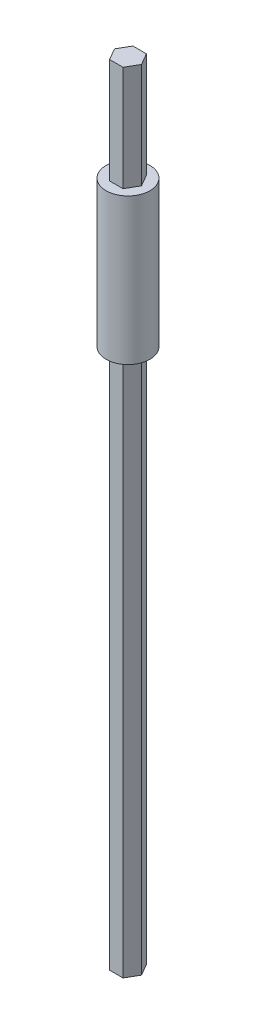
ISO-10303-21;
HEADER;
FILE_DESCRIPTION(('STEP AP214'),'2;1');
FILE_NAME('part.step','',(''),(''),'','','');
FILE_SCHEMA(('AUTOMOTIVE_DESIGN { 1 0 10303 214 1 1 1 1 }'));
ENDSEC;
DATA;
#1=APPLICATION_CONTEXT('core data for automotive mechanical design processes');
#2=APPLICATION_PROTOCOL_DEFINITION('international standard','automotive_design',2000,#1);
#3=PRODUCT_CONTEXT('',#1,'mechanical');
#4=PRODUCT('Part','Part','',(#3));
#5=PRODUCT_RELATED_PRODUCT_CATEGORY('part','',(#4));
#6=PRODUCT_DEFINITION_FORMATION('','',#4);
#7=PRODUCT_DEFINITION_CONTEXT('part definition',#1,'design');
#8=PRODUCT_DEFINITION('design','',#6,#7);
#9=PRODUCT_DEFINITION_SHAPE('','',#8);
#10=(LENGTH_UNIT() NAMED_UNIT(*) SI_UNIT(.MILLI.,.METRE.));
#11=(NAMED_UNIT(*) PLANE_ANGLE_UNIT() SI_UNIT($,.RADIAN.));
#12=(NAMED_UNIT(*) SI_UNIT($,.STERADIAN.) SOLID_ANGLE_UNIT());
#13=UNCERTAINTY_MEASURE_WITH_UNIT(LENGTH_MEASURE(1.E-05),#10,'distance_accuracy_value','');
#14=(GEOMETRIC_REPRESENTATION_CONTEXT(3) GLOBAL_UNCERTAINTY_ASSIGNED_CONTEXT((#13)) GLOBAL_UNIT_ASSIGNED_CONTEXT((#10,
#11,#12)) REPRESENTATION_CONTEXT('',''));
#15=CARTESIAN_POINT('',(0.,0.,0.));
#16=DIRECTION('',(0.,0.,1.));
#17=DIRECTION('',(1.,0.,0.));
#18=AXIS2_PLACEMENT_3D('',#15,#16,#17);
#19=CARTESIAN_POINT('',(1.5556349186104,71.3,-1.5556349186104));
#20=DIRECTION('',(0.,1.,0.));
#21=DIRECTION('',(0.,0.,1.));
#22=AXIS2_PLACEMENT_3D('',#19,#20,#21);
#23=PLANE('',#22);
#24=CARTESIAN_POINT('',(1.5556349186104,71.3,-1.5556349186104));
#25=DIRECTION('',(0.,1.,0.));
#26=DIRECTION('',(0.,0.,1.));
#27=AXIS2_PLACEMENT_3D('',#24,#25,#26);
#28=CIRCLE('',#27,3.75);
#29=CARTESIAN_POINT('',(1.5556349186104,71.3,2.1943650813896));
#30=VERTEX_POINT('',#29);
#31=EDGE_CURVE('E37',#30,#30,#28,.T.);
#32=ORIENTED_EDGE('',*,*,#31,.F.);
#33=EDGE_LOOP('',(#32));
#34=FACE_BOUND('',#33,.T.);
#35=DIRECTION('',(0.5,0.,0.866025403784439));
#36=VECTOR('',#35,1.);
#37=CARTESIAN_POINT('',(2.71033545698966,71.3,-3.55563491861041));
#38=LINE('',#37,#36);
#39=CARTESIAN_POINT('',(2.71033545698966,71.3,-3.55563491861041));
#40=VERTEX_POINT('',#39);
#41=CARTESIAN_POINT('',(3.86503599536891,71.3,-1.5556349186104));
#42=VERTEX_POINT('',#41);
#43=EDGE_CURVE('E142',#40,#42,#38,.T.);
#44=ORIENTED_EDGE('',*,*,#43,.F.);
#45=DIRECTION('',(1.,0.,0.));
#46=VECTOR('',#45,1.);
#47=CARTESIAN_POINT('',(0.400934380231152,71.3,-3.5556349186104));
#48=LINE('',#47,#46);
#49=CARTESIAN_POINT('',(0.400934380231152,71.3,-3.55563491861041));
#50=VERTEX_POINT('',#49);
#51=EDGE_CURVE('E139',#50,#40,#48,.T.);
#52=ORIENTED_EDGE('',*,*,#51,.F.);
#53=DIRECTION('',(0.5,0.,-0.866025403784438));
#54=VECTOR('',#53,1.);
#55=CARTESIAN_POINT('',(-0.7537661581481,71.3,-1.55563491861041));
#56=LINE('',#55,#54);
#57=CARTESIAN_POINT('',(-0.753766158148099,71.3,-1.55563491861041));
#58=VERTEX_POINT('',#57);
#59=EDGE_CURVE('E207',#58,#50,#56,.T.);
#60=ORIENTED_EDGE('',*,*,#59,.F.);
#61=DIRECTION('',(-0.5,0.,-0.866025403784439));
#62=VECTOR('',#61,1.);
#63=CARTESIAN_POINT('',(0.400934380231152,71.3,0.444365081389597));
#64=LINE('',#63,#62);
#65=CARTESIAN_POINT('',(0.400934380231153,71.3,0.444365081389597));
#66=VERTEX_POINT('',#65);
#67=EDGE_CURVE('E224',#66,#58,#64,.T.);
#68=ORIENTED_EDGE('',*,*,#67,.F.);
#69=DIRECTION('',(-1.,0.,0.));
#70=VECTOR('',#69,1.);
#71=CARTESIAN_POINT('',(2.71033545698965,71.3,0.444365081389597));
#72=LINE('',#71,#70);
#73=CARTESIAN_POINT('',(2.71033545698965,71.3,0.444365081389597));
#74=VERTEX_POINT('',#73);
#75=EDGE_CURVE('E53',#74,#66,#72,.T.);
#76=ORIENTED_EDGE('',*,*,#75,.F.);
#77=DIRECTION('',(-0.5,0.,0.866025403784438));
#78=VECTOR('',#77,1.);
#79=CARTESIAN_POINT('',(3.86503599536891,71.3,-1.5556349186104));
#80=LINE('',#79,#78);
#81=EDGE_CURVE('E48',#42,#74,#80,.T.);
#82=ORIENTED_EDGE('',*,*,#81,.F.);
#83=EDGE_LOOP('',(#44,#52,#60,#68,#76,#82));
#84=FACE_BOUND('',#83,.T.);
#85=ADVANCED_FACE('F33',(#34,#84),#23,.F.);
#86=CARTESIAN_POINT('',(1.5556349186104,96.3,-1.5556349186104));
#87=DIRECTION('',(0.,1.,0.));
#88=DIRECTION('',(0.,0.,1.));
#89=AXIS2_PLACEMENT_3D('',#86,#87,#88);
#90=PLANE('',#89);
#91=CARTESIAN_POINT('',(1.5556349186104,96.3,-1.5556349186104));
#92=DIRECTION('',(0.,1.,0.));
#93=DIRECTION('',(0.,0.,1.));
#94=AXIS2_PLACEMENT_3D('',#91,#92,#93);
#95=CIRCLE('',#94,3.75);
#96=CARTESIAN_POINT('',(1.5556349186104,96.3,2.1943650813896));
#97=VERTEX_POINT('',#96);
#98=EDGE_CURVE('E11',#97,#97,#95,.T.);
#99=ORIENTED_EDGE('',*,*,#98,.T.);
#100=EDGE_LOOP('',(#99));
#101=FACE_BOUND('',#100,.T.);
#102=DIRECTION('',(-0.5,0.,-0.866025403784439));
#103=VECTOR('',#102,1.);
#104=CARTESIAN_POINT('',(3.86503599536891,96.3,-1.55563491861041));
#105=LINE('',#104,#103);
#106=CARTESIAN_POINT('',(3.86503599536891,96.3,-1.55563491861041));
#107=VERTEX_POINT('',#106);
#108=CARTESIAN_POINT('',(2.71033545698966,96.3,-3.55563491861041));
#109=VERTEX_POINT('',#108);
#110=EDGE_CURVE('E146',#107,#109,#105,.T.);
#111=ORIENTED_EDGE('',*,*,#110,.F.);
#112=DIRECTION('',(0.5,0.,-0.866025403784439));
#113=VECTOR('',#112,1.);
#114=CARTESIAN_POINT('',(2.71033545698966,96.3,0.444365081389596));
#115=LINE('',#114,#113);
#116=CARTESIAN_POINT('',(2.71033545698966,96.3,0.444365081389596));
#117=VERTEX_POINT('',#116);
#118=EDGE_CURVE('E143',#117,#107,#115,.T.);
#119=ORIENTED_EDGE('',*,*,#118,.F.);
#120=DIRECTION('',(1.,0.,0.));
#121=VECTOR('',#120,1.);
#122=CARTESIAN_POINT('',(0.400934380231153,96.3,0.444365081389596));
#123=LINE('',#122,#121);
#124=CARTESIAN_POINT('',(0.400934380231152,96.3,0.444365081389596));
#125=VERTEX_POINT('',#124);
#126=EDGE_CURVE('E156',#125,#117,#123,.T.);
#127=ORIENTED_EDGE('',*,*,#126,.F.);
#128=DIRECTION('',(0.5,0.,0.866025403784438));
#129=VECTOR('',#128,1.);
#130=CARTESIAN_POINT('',(-0.753766158148099,96.3,-1.5556349186104));
#131=LINE('',#130,#129);
#132=CARTESIAN_POINT('',(-0.753766158148099,96.3,-1.5556349186104));
#133=VERTEX_POINT('',#132);
#134=EDGE_CURVE('E172',#133,#125,#131,.T.);
#135=ORIENTED_EDGE('',*,*,#134,.F.);
#136=DIRECTION('',(-0.5,0.,0.866025403784439));
#137=VECTOR('',#136,1.);
#138=CARTESIAN_POINT('',(0.400934380231153,96.3,-3.55563491861041));
#139=LINE('',#138,#137);
#140=CARTESIAN_POINT('',(0.400934380231153,96.3,-3.55563491861041));
#141=VERTEX_POINT('',#140);
#142=EDGE_CURVE('E170',#141,#133,#139,.T.);
#143=ORIENTED_EDGE('',*,*,#142,.F.);
#144=DIRECTION('',(-1.,0.,0.));
#145=VECTOR('',#144,1.);
#146=CARTESIAN_POINT('',(2.71033545698966,96.3,-3.55563491861041));
#147=LINE('',#146,#145);
#148=EDGE_CURVE('E168',#109,#141,#147,.T.);
#149=ORIENTED_EDGE('',*,*,#148,.F.);
#150=EDGE_LOOP('',(#111,#119,#127,#135,#143,#149));
#151=FACE_BOUND('',#150,.T.);
#152=ADVANCED_FACE('F197',(#101,#151),#90,.T.);
#153=CARTESIAN_POINT('',(1.5556349186104,96.3,-1.5556349186104));
#154=DIRECTION('',(0.,-1.,0.));
#155=DIRECTION('',(0.,0.,-1.));
#156=AXIS2_PLACEMENT_3D('',#153,#154,#155);
#157=CYLINDRICAL_SURFACE('',#156,3.75);
#158=ORIENTED_EDGE('',*,*,#98,.F.);
#159=EDGE_LOOP('',(#158));
#160=FACE_BOUND('',#159,.T.);
#161=ORIENTED_EDGE('',*,*,#31,.T.);
#162=EDGE_LOOP('',(#161));
#163=FACE_BOUND('',#162,.T.);
#164=ADVANCED_FACE('F35',(#160,#163),#157,.T.);
#165=CARTESIAN_POINT('',(2.71033545698966,114.3,0.444365081389596));
#166=DIRECTION('',(-0.866025403784439,0.,-0.5));
#167=DIRECTION('',(-0.5,0.,0.866025403784439));
#168=AXIS2_PLACEMENT_3D('',#165,#166,#167);
#169=PLANE('',#168);
#170=ORIENTED_EDGE('',*,*,#118,.T.);
#171=DIRECTION('',(0.,-1.,0.));
#172=VECTOR('',#171,1.);
#173=CARTESIAN_POINT('',(3.86503599536891,114.3,-1.55563491861041));
#174=LINE('',#173,#172);
#175=CARTESIAN_POINT('',(3.86503599536891,114.3,-1.55563491861041));
#176=VERTEX_POINT('',#175);
#177=EDGE_CURVE('E189',#176,#107,#174,.T.);
#178=ORIENTED_EDGE('',*,*,#177,.F.);
#179=DIRECTION('',(0.5,0.,-0.866025403784439));
#180=VECTOR('',#179,1.);
#181=CARTESIAN_POINT('',(2.71033545698966,114.3,0.444365081389596));
#182=LINE('',#181,#180);
#183=CARTESIAN_POINT('',(2.71033545698966,114.3,0.444365081389596));
#184=VERTEX_POINT('',#183);
#185=EDGE_CURVE('E152',#184,#176,#182,.T.);
#186=ORIENTED_EDGE('',*,*,#185,.F.);
#187=DIRECTION('',(0.,-1.,0.));
#188=VECTOR('',#187,1.);
#189=CARTESIAN_POINT('',(2.71033545698966,114.3,0.444365081389596));
#190=LINE('',#189,#188);
#191=EDGE_CURVE('E165',#184,#117,#190,.T.);
#192=ORIENTED_EDGE('',*,*,#191,.T.);
#193=EDGE_LOOP('',(#170,#178,#186,#192));
#194=FACE_BOUND('',#193,.T.);
#195=ADVANCED_FACE('F276',(#194),#169,.F.);
#196=CARTESIAN_POINT('',(3.86503599536891,114.3,-1.55563491861041));
#197=DIRECTION('',(-0.866025403784439,0.,0.5));
#198=DIRECTION('',(0.5,0.,0.866025403784439));
#199=AXIS2_PLACEMENT_3D('',#196,#197,#198);
#200=PLANE('',#199);
#201=ORIENTED_EDGE('',*,*,#110,.T.);
#202=DIRECTION('',(0.,-1.,0.));
#203=VECTOR('',#202,1.);
#204=CARTESIAN_POINT('',(2.71033545698966,114.3,-3.55563491861041));
#205=LINE('',#204,#203);
#206=CARTESIAN_POINT('',(2.71033545698966,114.3,-3.55563491861041));
#207=VERTEX_POINT('',#206);
#208=EDGE_CURVE('E186',#207,#109,#205,.T.);
#209=ORIENTED_EDGE('',*,*,#208,.F.);
#210=DIRECTION('',(-0.5,0.,-0.866025403784439));
#211=VECTOR('',#210,1.);
#212=CARTESIAN_POINT('',(3.86503599536891,114.3,-1.55563491861041));
#213=LINE('',#212,#211);
#214=EDGE_CURVE('E155',#176,#207,#213,.T.);
#215=ORIENTED_EDGE('',*,*,#214,.F.);
#216=ORIENTED_EDGE('',*,*,#177,.T.);
#217=EDGE_LOOP('',(#201,#209,#215,#216));
#218=FACE_BOUND('',#217,.T.);
#219=ADVANCED_FACE('F272',(#218),#200,.F.);
#220=CARTESIAN_POINT('',(2.71033545698966,114.3,-3.55563491861041));
#221=DIRECTION('',(0.,0.,1.));
#222=DIRECTION('',(1.,0.,0.));
#223=AXIS2_PLACEMENT_3D('',#220,#221,#222);
#224=PLANE('',#223);
#225=ORIENTED_EDGE('',*,*,#148,.T.);
#226=DIRECTION('',(0.,-1.,0.));
#227=VECTOR('',#226,1.);
#228=CARTESIAN_POINT('',(0.400934380231153,114.3,-3.55563491861041));
#229=LINE('',#228,#227);
#230=CARTESIAN_POINT('',(0.400934380231153,114.3,-3.55563491861041));
#231=VERTEX_POINT('',#230);
#232=EDGE_CURVE('E183',#231,#141,#229,.T.);
#233=ORIENTED_EDGE('',*,*,#232,.F.);
#234=DIRECTION('',(-1.,0.,0.));
#235=VECTOR('',#234,1.);
#236=CARTESIAN_POINT('',(2.71033545698966,114.3,-3.55563491861041));
#237=LINE('',#236,#235);
#238=EDGE_CURVE('E158',#207,#231,#237,.T.);
#239=ORIENTED_EDGE('',*,*,#238,.F.);
#240=ORIENTED_EDGE('',*,*,#208,.T.);
#241=EDGE_LOOP('',(#225,#233,#239,#240));
#242=FACE_BOUND('',#241,.T.);
#243=ADVANCED_FACE('F268',(#242),#224,.F.);
#244=CARTESIAN_POINT('',(0.400934380231153,114.3,-3.55563491861041));
#245=DIRECTION('',(0.866025403784439,0.,0.5));
#246=DIRECTION('',(0.5,0.,-0.866025403784439));
#247=AXIS2_PLACEMENT_3D('',#244,#245,#246);
#248=PLANE('',#247);
#249=ORIENTED_EDGE('',*,*,#142,.T.);
#250=DIRECTION('',(0.,-1.,0.));
#251=VECTOR('',#250,1.);
#252=CARTESIAN_POINT('',(-0.753766158148099,114.3,-1.5556349186104));
#253=LINE('',#252,#251);
#254=CARTESIAN_POINT('',(-0.753766158148099,114.3,-1.5556349186104));
#255=VERTEX_POINT('',#254);
#256=EDGE_CURVE('E180',#255,#133,#253,.T.);
#257=ORIENTED_EDGE('',*,*,#256,.F.);
#258=DIRECTION('',(-0.5,0.,0.866025403784439));
#259=VECTOR('',#258,1.);
#260=CARTESIAN_POINT('',(0.400934380231153,114.3,-3.55563491861041));
#261=LINE('',#260,#259);
#262=EDGE_CURVE('E160',#231,#255,#261,.T.);
#263=ORIENTED_EDGE('',*,*,#262,.F.);
#264=ORIENTED_EDGE('',*,*,#232,.T.);
#265=EDGE_LOOP('',(#249,#257,#263,#264));
#266=FACE_BOUND('',#265,.T.);
#267=ADVANCED_FACE('F264',(#266),#248,.F.);
#268=CARTESIAN_POINT('',(-0.753766158148099,114.3,-1.5556349186104));
#269=DIRECTION('',(0.866025403784439,0.,-0.5));
#270=DIRECTION('',(-0.5,0.,-0.866025403784439));
#271=AXIS2_PLACEMENT_3D('',#268,#269,#270);
#272=PLANE('',#271);
#273=ORIENTED_EDGE('',*,*,#134,.T.);
#274=DIRECTION('',(0.,-1.,0.));
#275=VECTOR('',#274,1.);
#276=CARTESIAN_POINT('',(0.400934380231153,114.3,0.444365081389596));
#277=LINE('',#276,#275);
#278=CARTESIAN_POINT('',(0.400934380231153,114.3,0.444365081389596));
#279=VERTEX_POINT('',#278);
#280=EDGE_CURVE('E178',#279,#125,#277,.T.);
#281=ORIENTED_EDGE('',*,*,#280,.F.);
#282=DIRECTION('',(0.5,0.,0.866025403784438));
#283=VECTOR('',#282,1.);
#284=CARTESIAN_POINT('',(-0.753766158148099,114.3,-1.5556349186104));
#285=LINE('',#284,#283);
#286=EDGE_CURVE('E162',#255,#279,#285,.T.);
#287=ORIENTED_EDGE('',*,*,#286,.F.);
#288=ORIENTED_EDGE('',*,*,#256,.T.);
#289=EDGE_LOOP('',(#273,#281,#287,#288));
#290=FACE_BOUND('',#289,.T.);
#291=ADVANCED_FACE('F260',(#290),#272,.F.);
#292=CARTESIAN_POINT('',(0.400934380231153,114.3,0.444365081389596));
#293=DIRECTION('',(0.,0.,-1.));
#294=DIRECTION('',(-1.,0.,0.));
#295=AXIS2_PLACEMENT_3D('',#292,#293,#294);
#296=PLANE('',#295);
#297=ORIENTED_EDGE('',*,*,#126,.T.);
#298=ORIENTED_EDGE('',*,*,#191,.F.);
#299=DIRECTION('',(1.,0.,0.));
#300=VECTOR('',#299,1.);
#301=CARTESIAN_POINT('',(0.400934380231153,114.3,0.444365081389596));
#302=LINE('',#301,#300);
#303=EDGE_CURVE('E164',#279,#184,#302,.T.);
#304=ORIENTED_EDGE('',*,*,#303,.F.);
#305=ORIENTED_EDGE('',*,*,#280,.T.);
#306=EDGE_LOOP('',(#297,#298,#304,#305));
#307=FACE_BOUND('',#306,.T.);
#308=ADVANCED_FACE('F256',(#307),#296,.F.);
#309=CARTESIAN_POINT('',(0.,114.3,0.));
#310=DIRECTION('',(0.,1.,0.));
#311=DIRECTION('',(0.,0.,1.));
#312=AXIS2_PLACEMENT_3D('',#309,#310,#311);
#313=PLANE('',#312);
#314=ORIENTED_EDGE('',*,*,#185,.T.);
#315=ORIENTED_EDGE('',*,*,#214,.T.);
#316=ORIENTED_EDGE('',*,*,#238,.T.);
#317=ORIENTED_EDGE('',*,*,#262,.T.);
#318=ORIENTED_EDGE('',*,*,#286,.T.);
#319=ORIENTED_EDGE('',*,*,#303,.T.);
#320=EDGE_LOOP('',(#314,#315,#316,#317,#318,#319));
#321=FACE_BOUND('',#320,.T.);
#322=ADVANCED_FACE('F253',(#321),#313,.T.);
#323=CARTESIAN_POINT('',(2.71033545698966,-20.7,-3.55563491861041));
#324=DIRECTION('',(-0.866025403784439,0.,0.5));
#325=DIRECTION('',(0.5,0.,0.866025403784439));
#326=AXIS2_PLACEMENT_3D('',#323,#324,#325);
#327=PLANE('',#326);
#328=ORIENTED_EDGE('',*,*,#43,.T.);
#329=DIRECTION('',(0.,1.,0.));
#330=VECTOR('',#329,1.);
#331=CARTESIAN_POINT('',(3.86503599536891,-20.7,-1.5556349186104));
#332=LINE('',#331,#330);
#333=CARTESIAN_POINT('',(3.86503599536891,-20.7,-1.5556349186104));
#334=VERTEX_POINT('',#333);
#335=EDGE_CURVE('E123',#334,#42,#332,.T.);
#336=ORIENTED_EDGE('',*,*,#335,.F.);
#337=DIRECTION('',(0.5,0.,0.866025403784439));
#338=VECTOR('',#337,1.);
#339=CARTESIAN_POINT('',(2.71033545698966,-20.7,-3.55563491861041));
#340=LINE('',#339,#338);
#341=CARTESIAN_POINT('',(2.71033545698966,-20.7,-3.55563491861041));
#342=VERTEX_POINT('',#341);
#343=EDGE_CURVE('E130',#342,#334,#340,.T.);
#344=ORIENTED_EDGE('',*,*,#343,.F.);
#345=DIRECTION('',(0.,1.,0.));
#346=VECTOR('',#345,1.);
#347=CARTESIAN_POINT('',(2.71033545698966,-20.7,-3.55563491861041));
#348=LINE('',#347,#346);
#349=EDGE_CURVE('E204',#342,#40,#348,.T.);
#350=ORIENTED_EDGE('',*,*,#349,.T.);
#351=EDGE_LOOP('',(#328,#336,#344,#350));
#352=FACE_BOUND('',#351,.T.);
#353=ADVANCED_FACE('F141',(#352),#327,.F.);
#354=CARTESIAN_POINT('',(3.86503599536891,-20.7,-1.5556349186104));
#355=DIRECTION('',(-0.866025403784438,0.,-0.5));
#356=DIRECTION('',(-0.5,0.,0.866025403784438));
#357=AXIS2_PLACEMENT_3D('',#354,#355,#356);
#358=PLANE('',#357);
#359=ORIENTED_EDGE('',*,*,#81,.T.);
#360=DIRECTION('',(0.,1.,0.));
#361=VECTOR('',#360,1.);
#362=CARTESIAN_POINT('',(2.71033545698965,-20.7,0.444365081389597));
#363=LINE('',#362,#361);
#364=CARTESIAN_POINT('',(2.71033545698965,-20.7,0.444365081389597));
#365=VERTEX_POINT('',#364);
#366=EDGE_CURVE('E126',#365,#74,#363,.T.);
#367=ORIENTED_EDGE('',*,*,#366,.F.);
#368=DIRECTION('',(-0.5,0.,0.866025403784438));
#369=VECTOR('',#368,1.);
#370=CARTESIAN_POINT('',(3.86503599536891,-20.7,-1.5556349186104));
#371=LINE('',#370,#369);
#372=EDGE_CURVE('E119',#334,#365,#371,.T.);
#373=ORIENTED_EDGE('',*,*,#372,.F.);
#374=ORIENTED_EDGE('',*,*,#335,.T.);
#375=EDGE_LOOP('',(#359,#367,#373,#374));
#376=FACE_BOUND('',#375,.T.);
#377=ADVANCED_FACE('F121',(#376),#358,.F.);
#378=CARTESIAN_POINT('',(2.71033545698965,-20.7,0.444365081389597));
#379=DIRECTION('',(0.,0.,-1.));
#380=DIRECTION('',(-1.,0.,0.));
#381=AXIS2_PLACEMENT_3D('',#378,#379,#380);
#382=PLANE('',#381);
#383=ORIENTED_EDGE('',*,*,#75,.T.);
#384=DIRECTION('',(0.,1.,0.));
#385=VECTOR('',#384,1.);
#386=CARTESIAN_POINT('',(0.400934380231152,-20.7,0.444365081389597));
#387=LINE('',#386,#385);
#388=CARTESIAN_POINT('',(0.400934380231152,-20.7,0.444365081389597));
#389=VERTEX_POINT('',#388);
#390=EDGE_CURVE('E148',#389,#66,#387,.T.);
#391=ORIENTED_EDGE('',*,*,#390,.F.);
#392=DIRECTION('',(-1.,0.,0.));
#393=VECTOR('',#392,1.);
#394=CARTESIAN_POINT('',(2.71033545698965,-20.7,0.444365081389597));
#395=LINE('',#394,#393);
#396=EDGE_CURVE('E129',#365,#389,#395,.T.);
#397=ORIENTED_EDGE('',*,*,#396,.F.);
#398=ORIENTED_EDGE('',*,*,#366,.T.);
#399=EDGE_LOOP('',(#383,#391,#397,#398));
#400=FACE_BOUND('',#399,.T.);
#401=ADVANCED_FACE('F227',(#400),#382,.F.);
#402=CARTESIAN_POINT('',(0.400934380231152,-20.7,0.444365081389597));
#403=DIRECTION('',(0.866025403784439,0.,-0.5));
#404=DIRECTION('',(-0.5,0.,-0.866025403784439));
#405=AXIS2_PLACEMENT_3D('',#402,#403,#404);
#406=PLANE('',#405);
#407=ORIENTED_EDGE('',*,*,#67,.T.);
#408=DIRECTION('',(0.,1.,0.));
#409=VECTOR('',#408,1.);
#410=CARTESIAN_POINT('',(-0.7537661581481,-20.7,-1.55563491861041));
#411=LINE('',#410,#409);
#412=CARTESIAN_POINT('',(-0.7537661581481,-20.7,-1.55563491861041));
#413=VERTEX_POINT('',#412);
#414=EDGE_CURVE('E210',#413,#58,#411,.T.);
#415=ORIENTED_EDGE('',*,*,#414,.F.);
#416=DIRECTION('',(-0.5,0.,-0.866025403784439));
#417=VECTOR('',#416,1.);
#418=CARTESIAN_POINT('',(0.400934380231152,-20.7,0.444365081389597));
#419=LINE('',#418,#417);
#420=EDGE_CURVE('E225',#389,#413,#419,.T.);
#421=ORIENTED_EDGE('',*,*,#420,.F.);
#422=ORIENTED_EDGE('',*,*,#390,.T.);
#423=EDGE_LOOP('',(#407,#415,#421,#422));
#424=FACE_BOUND('',#423,.T.);
#425=ADVANCED_FACE('F222',(#424),#406,.F.);
#426=CARTESIAN_POINT('',(-0.7537661581481,-20.7,-1.55563491861041));
#427=DIRECTION('',(0.866025403784438,0.,0.5));
#428=DIRECTION('',(0.5,0.,-0.866025403784439));
#429=AXIS2_PLACEMENT_3D('',#426,#427,#428);
#430=PLANE('',#429);
#431=ORIENTED_EDGE('',*,*,#59,.T.);
#432=DIRECTION('',(0.,1.,0.));
#433=VECTOR('',#432,1.);
#434=CARTESIAN_POINT('',(0.400934380231152,-20.7,-3.5556349186104));
#435=LINE('',#434,#433);
#436=CARTESIAN_POINT('',(0.400934380231152,-20.7,-3.5556349186104));
#437=VERTEX_POINT('',#436);
#438=EDGE_CURVE('E206',#437,#50,#435,.T.);
#439=ORIENTED_EDGE('',*,*,#438,.F.);
#440=DIRECTION('',(0.5,0.,-0.866025403784438));
#441=VECTOR('',#440,1.);
#442=CARTESIAN_POINT('',(-0.7537661581481,-20.7,-1.55563491861041));
#443=LINE('',#442,#441);
#444=EDGE_CURVE('E212',#413,#437,#443,.T.);
#445=ORIENTED_EDGE('',*,*,#444,.F.);
#446=ORIENTED_EDGE('',*,*,#414,.T.);
#447=EDGE_LOOP('',(#431,#439,#445,#446));
#448=FACE_BOUND('',#447,.T.);
#449=ADVANCED_FACE('F232',(#448),#430,.F.);
#450=CARTESIAN_POINT('',(0.400934380231152,-20.7,-3.5556349186104));
#451=DIRECTION('',(0.,0.,1.));
#452=DIRECTION('',(1.,0.,0.));
#453=AXIS2_PLACEMENT_3D('',#450,#451,#452);
#454=PLANE('',#453);
#455=ORIENTED_EDGE('',*,*,#51,.T.);
#456=ORIENTED_EDGE('',*,*,#349,.F.);
#457=DIRECTION('',(1.,0.,0.));
#458=VECTOR('',#457,1.);
#459=CARTESIAN_POINT('',(0.400934380231152,-20.7,-3.5556349186104));
#460=LINE('',#459,#458);
#461=EDGE_CURVE('E135',#437,#342,#460,.T.);
#462=ORIENTED_EDGE('',*,*,#461,.F.);
#463=ORIENTED_EDGE('',*,*,#438,.T.);
#464=EDGE_LOOP('',(#455,#456,#462,#463));
#465=FACE_BOUND('',#464,.T.);
#466=ADVANCED_FACE('F203',(#465),#454,.F.);
#467=CARTESIAN_POINT('',(0.,-20.7,0.));
#468=DIRECTION('',(0.,-1.,0.));
#469=DIRECTION('',(0.,0.,-1.));
#470=AXIS2_PLACEMENT_3D('',#467,#468,#469);
#471=PLANE('',#470);
#472=ORIENTED_EDGE('',*,*,#343,.T.);
#473=ORIENTED_EDGE('',*,*,#372,.T.);
#474=ORIENTED_EDGE('',*,*,#396,.T.);
#475=ORIENTED_EDGE('',*,*,#420,.T.);
#476=ORIENTED_EDGE('',*,*,#444,.T.);
#477=ORIENTED_EDGE('',*,*,#461,.T.);
#478=EDGE_LOOP('',(#472,#473,#474,#475,#476,#477));
#479=FACE_BOUND('',#478,.T.);
#480=ADVANCED_FACE('F133',(#479),#471,.T.);
#481=CLOSED_SHELL('',(#85,#152,#164,#195,#219,#243,#267,#291,#308,#322,#353,#377,#401,#425,#449,
#466,#480));
#482=MANIFOLD_SOLID_BREP('B2',#481);
#483=ADVANCED_BREP_SHAPE_REPRESENTATION('',(#18,#482),#14);
#484=SHAPE_DEFINITION_REPRESENTATION(#9,#483);
ENDSEC;
END-ISO-10303-21;
